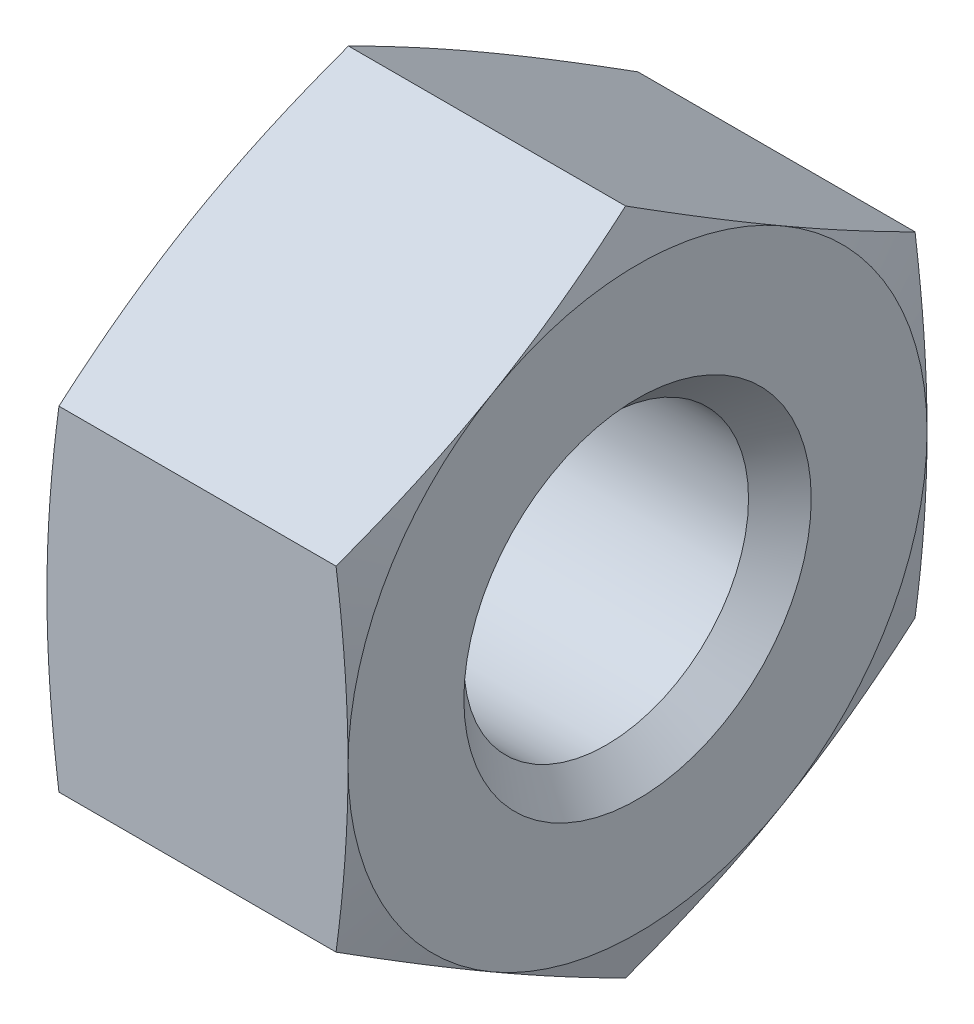
ISO-10303-21;
HEADER;
FILE_DESCRIPTION(('STEP AP214'),'2;1');
FILE_NAME('part.step','',(''),(''),'','','');
FILE_SCHEMA(('AUTOMOTIVE_DESIGN { 1 0 10303 214 1 1 1 1 }'));
ENDSEC;
DATA;
#1=APPLICATION_CONTEXT('core data for automotive mechanical design processes');
#2=APPLICATION_PROTOCOL_DEFINITION('international standard','automotive_design',2000,#1);
#3=PRODUCT_CONTEXT('',#1,'mechanical');
#4=PRODUCT('Part','Part','',(#3));
#5=PRODUCT_RELATED_PRODUCT_CATEGORY('part','',(#4));
#6=PRODUCT_DEFINITION_FORMATION('','',#4);
#7=PRODUCT_DEFINITION_CONTEXT('part definition',#1,'design');
#8=PRODUCT_DEFINITION('design','',#6,#7);
#9=PRODUCT_DEFINITION_SHAPE('','',#8);
#10=(LENGTH_UNIT() NAMED_UNIT(*) SI_UNIT(.MILLI.,.METRE.));
#11=(NAMED_UNIT(*) PLANE_ANGLE_UNIT() SI_UNIT($,.RADIAN.));
#12=(NAMED_UNIT(*) SI_UNIT($,.STERADIAN.) SOLID_ANGLE_UNIT());
#13=UNCERTAINTY_MEASURE_WITH_UNIT(LENGTH_MEASURE(1.E-05),#10,'distance_accuracy_value','');
#14=(GEOMETRIC_REPRESENTATION_CONTEXT(3) GLOBAL_UNCERTAINTY_ASSIGNED_CONTEXT((#13)) GLOBAL_UNIT_ASSIGNED_CONTEXT((#10,
#11,#12)) REPRESENTATION_CONTEXT('',''));
#15=CARTESIAN_POINT('',(0.,0.,0.));
#16=DIRECTION('',(0.,0.,1.));
#17=DIRECTION('',(1.,0.,0.));
#18=AXIS2_PLACEMENT_3D('',#15,#16,#17);
#19=CARTESIAN_POINT('',(28.,-2.5,0.));
#20=DIRECTION('',(-1.,0.,0.));
#21=DIRECTION('',(0.,0.,1.));
#22=AXIS2_PLACEMENT_3D('',#19,#20,#21);
#23=PLANE('',#22);
#24=CARTESIAN_POINT('',(27.9999999999957,0.,0.));
#25=DIRECTION('',(1.,0.,0.));
#26=DIRECTION('',(0.,0.,-1.));
#27=AXIS2_PLACEMENT_3D('',#24,#25,#26);
#28=CIRCLE('',#27,4.99999999999545);
#29=CARTESIAN_POINT('',(27.9999999999963,-4.33012701892022,-2.49999999999886));
#30=VERTEX_POINT('',#29);
#31=CARTESIAN_POINT('',(27.9999999999963,0.,-4.99999999999773));
#32=VERTEX_POINT('',#31);
#33=EDGE_CURVE('E119',#30,#32,#28,.T.);
#34=ORIENTED_EDGE('',*,*,#33,.F.);
#35=CARTESIAN_POINT('',(27.9999999999957,0.,0.));
#36=DIRECTION('',(1.,0.,0.));
#37=DIRECTION('',(0.,0.,-1.));
#38=AXIS2_PLACEMENT_3D('',#35,#36,#37);
#39=CIRCLE('',#38,4.99999999999545);
#40=CARTESIAN_POINT('',(27.9999999999963,-4.33012701892022,2.49999999999886));
#41=VERTEX_POINT('',#40);
#42=EDGE_CURVE('E107',#41,#30,#39,.T.);
#43=ORIENTED_EDGE('',*,*,#42,.F.);
#44=CARTESIAN_POINT('',(27.9999999999957,0.,0.));
#45=DIRECTION('',(1.,0.,0.));
#46=DIRECTION('',(0.,0.,-1.));
#47=AXIS2_PLACEMENT_3D('',#44,#45,#46);
#48=CIRCLE('',#47,4.99999999999545);
#49=CARTESIAN_POINT('',(27.9999999999963,0.,4.99999999999773));
#50=VERTEX_POINT('',#49);
#51=EDGE_CURVE('E115',#50,#41,#48,.T.);
#52=ORIENTED_EDGE('',*,*,#51,.F.);
#53=CARTESIAN_POINT('',(27.9999999999957,0.,0.));
#54=DIRECTION('',(1.,0.,0.));
#55=DIRECTION('',(0.,0.,-1.));
#56=AXIS2_PLACEMENT_3D('',#53,#54,#55);
#57=CIRCLE('',#56,4.99999999999545);
#58=CARTESIAN_POINT('',(27.9999999999963,4.33012701892023,2.49999999999886));
#59=VERTEX_POINT('',#58);
#60=EDGE_CURVE('E116',#59,#50,#57,.T.);
#61=ORIENTED_EDGE('',*,*,#60,.F.);
#62=CARTESIAN_POINT('',(27.9999999999957,0.,0.));
#63=DIRECTION('',(1.,0.,0.));
#64=DIRECTION('',(0.,0.,-1.));
#65=AXIS2_PLACEMENT_3D('',#62,#63,#64);
#66=CIRCLE('',#65,4.99999999999545);
#67=CARTESIAN_POINT('',(27.9999999999963,4.33012701892022,-2.49999999999886));
#68=VERTEX_POINT('',#67);
#69=EDGE_CURVE('E353',#68,#59,#66,.T.);
#70=ORIENTED_EDGE('',*,*,#69,.F.);
#71=CARTESIAN_POINT('',(27.9999999999957,0.,0.));
#72=DIRECTION('',(1.,0.,0.));
#73=DIRECTION('',(0.,0.,-1.));
#74=AXIS2_PLACEMENT_3D('',#71,#72,#73);
#75=CIRCLE('',#74,4.99999999999545);
#76=EDGE_CURVE('E102',#32,#68,#75,.T.);
#77=ORIENTED_EDGE('',*,*,#76,.F.);
#78=EDGE_LOOP('',(#34,#43,#52,#61,#70,#77));
#79=FACE_BOUND('',#78,.T.);
#80=CARTESIAN_POINT('',(28.0000000000769,0.,0.));
#81=DIRECTION('',(-1.,0.,0.));
#82=DIRECTION('',(0.,0.,1.));
#83=AXIS2_PLACEMENT_3D('',#80,#81,#82);
#84=CIRCLE('',#83,3.00000000004275);
#85=CARTESIAN_POINT('',(28.0000000000769,0.,3.00000000004275));
#86=VERTEX_POINT('',#85);
#87=EDGE_CURVE('E19',#86,#86,#84,.F.);
#88=ORIENTED_EDGE('',*,*,#87,.T.);
#89=EDGE_LOOP('',(#88));
#90=FACE_BOUND('',#89,.T.);
#91=ADVANCED_FACE('F16',(#79,#90),#23,.T.);
#92=CARTESIAN_POINT('',(27.9999999999632,0.,0.));
#93=DIRECTION('',(-1.,0.,0.));
#94=DIRECTION('',(0.,0.,1.));
#95=AXIS2_PLACEMENT_3D('',#92,#93,#94);
#96=CONICAL_SURFACE('',#95,3.00000000015643,0.785398163397449);
#97=CARTESIAN_POINT('',(28.5415,0.,0.));
#98=DIRECTION('',(-1.,0.,0.));
#99=DIRECTION('',(0.,0.,1.));
#100=AXIS2_PLACEMENT_3D('',#97,#98,#99);
#101=CIRCLE('',#100,2.4585);
#102=CARTESIAN_POINT('',(28.5415,0.,2.4585));
#103=VERTEX_POINT('',#102);
#104=EDGE_CURVE('E130',#103,#103,#101,.F.);
#105=ORIENTED_EDGE('',*,*,#104,.T.);
#106=EDGE_LOOP('',(#105));
#107=FACE_BOUND('',#106,.T.);
#108=ORIENTED_EDGE('',*,*,#87,.F.);
#109=EDGE_LOOP('',(#108));
#110=FACE_BOUND('',#109,.T.);
#111=ADVANCED_FACE('F272',(#107,#110),#96,.F.);
#112=CARTESIAN_POINT('',(28.2085029781172,0.,0.));
#113=DIRECTION('',(1.,0.,0.));
#114=DIRECTION('',(0.,0.,-1.));
#115=AXIS2_PLACEMENT_3D('',#112,#113,#114);
#116=CONICAL_SURFACE('',#115,5.77814370780061,1.30899693897207);
#117=CARTESIAN_POINT('',(28.2072594216531,-2.88675134594922,-4.99999999999812));
#118=CARTESIAN_POINT('',(28.1751868902419,-3.00640731976661,-4.79274977391727));
#119=CARTESIAN_POINT('',(28.1460634724852,-3.12627806694556,-4.58512754946207));
#120=CARTESIAN_POINT('',(28.0949189942107,-3.36625695280206,-4.16947192641484));
#121=CARTESIAN_POINT('',(28.0728898901268,-3.48636466617724,-3.96143926446813));
#122=CARTESIAN_POINT('',(28.0370556248134,-3.72692623505237,-3.54477440482791));
#123=CARTESIAN_POINT('',(28.0232524038587,-3.84738016548898,-3.33614207734033));
#124=CARTESIAN_POINT('',(28.0093512093144,-4.02825540850207,-3.02285696661029));
#125=CARTESIAN_POINT('',(28.005851364793,-4.08861477683098,-2.91831147395186));
#126=CARTESIAN_POINT('',(28.0011729767152,-4.2093578690658,-2.70917830353818));
#127=CARTESIAN_POINT('',(27.9999945078464,-4.26974159369283,-2.60459062453391));
#128=CARTESIAN_POINT('',(27.9999999999969,-4.33012701892219,-2.5));
#129=B_SPLINE_CURVE_WITH_KNOTS('',3,(#117,#118,#119,#120,#121,#122,#123,#124,#125,#126,#127,
#128),.UNSPECIFIED.,.F.,.F.,(4,2,2,2,2,4),(0.,0.724386084306961,1.44794794084586,
2.17168039959076,2.53396910222323,2.89626946090248),.UNSPECIFIED.);
#130=CARTESIAN_POINT('',(28.2072594216531,-2.88675134594759,-4.99999999999906));
#131=VERTEX_POINT('',#130);
#132=EDGE_CURVE('E125',#131,#30,#129,.T.);
#133=ORIENTED_EDGE('',*,*,#132,.T.);
#134=ORIENTED_EDGE('',*,*,#33,.T.);
#135=CARTESIAN_POINT('',(27.9999999999969,0.,-5.));
#136=CARTESIAN_POINT('',(27.9999945078464,-0.12077085045873,-5.));
#137=CARTESIAN_POINT('',(28.0011729767152,-0.241538299712794,-5.));
#138=CARTESIAN_POINT('',(28.005851364793,-0.483024484182428,-5.));
#139=CARTESIAN_POINT('',(28.0093512093144,-0.603743220840241,-5.));
#140=CARTESIAN_POINT('',(28.0232524038587,-0.965493706866423,-5.));
#141=CARTESIAN_POINT('',(28.0370556248134,-1.20640156773965,-5.));
#142=CARTESIAN_POINT('',(28.0728898901268,-1.68752470548992,-5.));
#143=CARTESIAN_POINT('',(28.0949189942107,-1.92774013224026,-5.));
#144=CARTESIAN_POINT('',(28.1460634724852,-2.40769790395326,-5.));
#145=CARTESIAN_POINT('',(28.1751868902419,-2.64743939831118,-5.));
#146=CARTESIAN_POINT('',(28.2072594216531,-2.88675134594596,-5.));
#147=B_SPLINE_CURVE_WITH_KNOTS('',3,(#135,#136,#137,#138,#139,#140,#141,#142,#143,#144,#145,
#146),.UNSPECIFIED.,.F.,.F.,(4,2,2,2,2,4),(0.,0.36230035867925,0.724589061311718,
1.44832152005662,2.17188337659552,2.89626946090248),.UNSPECIFIED.);
#148=EDGE_CURVE('E127',#32,#131,#147,.T.);
#149=ORIENTED_EDGE('',*,*,#148,.T.);
#150=EDGE_LOOP('',(#133,#134,#149));
#151=FACE_BOUND('',#150,.T.);
#152=ADVANCED_FACE('F126',(#151),#116,.T.);
#153=CARTESIAN_POINT('',(28.2085029781172,0.,0.));
#154=DIRECTION('',(1.,0.,0.));
#155=DIRECTION('',(0.,0.,-1.));
#156=AXIS2_PLACEMENT_3D('',#153,#154,#155);
#157=CONICAL_SURFACE('',#156,5.77814370780061,1.30899693897207);
#158=ORIENTED_EDGE('',*,*,#76,.T.);
#159=CARTESIAN_POINT('',(27.9999999999969,4.33012701892219,-2.5));
#160=CARTESIAN_POINT('',(27.9999945078464,4.26974159369283,-2.60459062453391));
#161=CARTESIAN_POINT('',(28.0011729767152,4.2093578690658,-2.70917830353818));
#162=CARTESIAN_POINT('',(28.005851364793,4.08861477683098,-2.91831147395186));
#163=CARTESIAN_POINT('',(28.0093512093144,4.02825540850207,-3.02285696661029));
#164=CARTESIAN_POINT('',(28.0232524038587,3.84738016548898,-3.33614207734033));
#165=CARTESIAN_POINT('',(28.0370556248134,3.72692623505237,-3.54477440482791));
#166=CARTESIAN_POINT('',(28.0728898901268,3.48636466617723,-3.96143926446812));
#167=CARTESIAN_POINT('',(28.0949189942107,3.36625695280206,-4.16947192641484));
#168=CARTESIAN_POINT('',(28.1460634724852,3.12627806694556,-4.58512754946207));
#169=CARTESIAN_POINT('',(28.1751868902419,3.0064073197666,-4.79274977391727));
#170=CARTESIAN_POINT('',(28.2072594216531,2.88675134594922,-4.99999999999812));
#171=B_SPLINE_CURVE_WITH_KNOTS('',3,(#159,#160,#161,#162,#163,#164,#165,#166,#167,#168,#169,
#170),.UNSPECIFIED.,.F.,.F.,(4,2,2,2,2,4),(0.,0.36230035867925,0.724589061311717,
1.44832152005662,2.17188337659552,2.89626946090248),.UNSPECIFIED.);
#172=CARTESIAN_POINT('',(28.2072594216531,2.88675134594759,-4.99999999999906));
#173=VERTEX_POINT('',#172);
#174=EDGE_CURVE('E374',#68,#173,#171,.T.);
#175=ORIENTED_EDGE('',*,*,#174,.T.);
#176=CARTESIAN_POINT('',(28.2072594216531,2.88675134594596,-5.));
#177=CARTESIAN_POINT('',(28.1751868902419,2.64743939831118,-5.));
#178=CARTESIAN_POINT('',(28.1460634724852,2.40769790395326,-5.));
#179=CARTESIAN_POINT('',(28.0949189942107,1.92774013224026,-5.));
#180=CARTESIAN_POINT('',(28.0728898901268,1.68752470548992,-5.));
#181=CARTESIAN_POINT('',(28.0370556248134,1.20640156773965,-5.));
#182=CARTESIAN_POINT('',(28.0232524038587,0.965493706866422,-5.));
#183=CARTESIAN_POINT('',(28.0093512093144,0.60374322084024,-5.));
#184=CARTESIAN_POINT('',(28.005851364793,0.483024484182426,-5.));
#185=CARTESIAN_POINT('',(28.0011729767152,0.241538299712792,-5.));
#186=CARTESIAN_POINT('',(27.9999945078464,0.120770850458729,-5.));
#187=CARTESIAN_POINT('',(27.9999999999969,0.,-5.));
#188=B_SPLINE_CURVE_WITH_KNOTS('',3,(#176,#177,#178,#179,#180,#181,#182,#183,#184,#185,#186,
#187),.UNSPECIFIED.,.F.,.F.,(4,2,2,2,2,4),(0.,0.724386084306962,1.44794794084586,
2.17168039959077,2.53396910222323,2.89626946090248),.UNSPECIFIED.);
#189=EDGE_CURVE('E135',#173,#32,#188,.T.);
#190=ORIENTED_EDGE('',*,*,#189,.T.);
#191=EDGE_LOOP('',(#158,#175,#190));
#192=FACE_BOUND('',#191,.T.);
#193=ADVANCED_FACE('F271',(#192),#157,.T.);
#194=CARTESIAN_POINT('',(28.2085029781172,0.,0.));
#195=DIRECTION('',(1.,0.,0.));
#196=DIRECTION('',(0.,0.,-1.));
#197=AXIS2_PLACEMENT_3D('',#194,#195,#196);
#198=CONICAL_SURFACE('',#197,5.77814370780061,1.30899693897207);
#199=ORIENTED_EDGE('',*,*,#69,.T.);
#200=CARTESIAN_POINT('',(27.9999999999969,4.3301270189222,2.5));
#201=CARTESIAN_POINT('',(27.9999945078464,4.39051244415103,2.39540937546701));
#202=CARTESIAN_POINT('',(28.0011729767152,4.45089616877753,2.29082169646366));
#203=CARTESIAN_POINT('',(28.0058513647929,4.57163926101128,2.08168852605182));
#204=CARTESIAN_POINT('',(28.0093512093142,4.63199862933966,1.97714303339431));
#205=CARTESIAN_POINT('',(28.0232524038583,4.81287387235117,1.66385792266702));
#206=CARTESIAN_POINT('',(28.0370556248128,4.93332780278673,1.45522559518126));
#207=CARTESIAN_POINT('',(28.0728898901256,5.17388937165976,1.03856073554468));
#208=CARTESIAN_POINT('',(28.0949189942091,5.29399708503389,0.830528073599776));
#209=CARTESIAN_POINT('',(28.1460634724828,5.5339759708883,0.414872450556162));
#210=CARTESIAN_POINT('',(28.175186890239,5.65384671806622,0.207250226102765));
#211=CARTESIAN_POINT('',(28.2072594216498,5.77350269188257,2.37145483499561E-11));
#212=B_SPLINE_CURVE_WITH_KNOTS('',3,(#200,#201,#202,#203,#204,#205,#206,#207,#208,#209,#210,
#211),.UNSPECIFIED.,.F.,.F.,(4,2,2,2,2,4),(0.,0.362300358676065,0.724589061305347,
1.4483215200439,2.17188337657645,2.89626946087705),.UNSPECIFIED.);
#213=CARTESIAN_POINT('',(28.2072594216849,5.77350269196408,-1.11263001348021E-11));
#214=VERTEX_POINT('',#213);
#215=EDGE_CURVE('E327',#59,#214,#212,.T.);
#216=ORIENTED_EDGE('',*,*,#215,.T.);
#217=CARTESIAN_POINT('',(28.2072594216626,5.77350269186875,-1.57368146966054E-11));
#218=CARTESIAN_POINT('',(28.1751868902437,5.65384671806165,-0.207250226099235));
#219=CARTESIAN_POINT('',(28.1460634724841,5.53397597088746,-0.414872450554556));
#220=CARTESIAN_POINT('',(28.0949189942079,5.29399708503567,-0.830528073599747));
#221=CARTESIAN_POINT('',(28.0728898901253,5.17388937166044,-1.03856073554431));
#222=CARTESIAN_POINT('',(28.0370556248131,4.93332780278657,-1.45522559518071));
#223=CARTESIAN_POINT('',(28.0232524038584,4.81287387235129,-1.66385792266664));
#224=CARTESIAN_POINT('',(28.0093512093142,4.63199862933984,-1.97714303339407));
#225=CARTESIAN_POINT('',(28.0058513647929,4.57163926101142,-2.08168852605162));
#226=CARTESIAN_POINT('',(28.0011729767152,4.45089616877757,-2.29082169646354));
#227=CARTESIAN_POINT('',(27.9999945078464,4.39051244415102,-2.39540937546694));
#228=CARTESIAN_POINT('',(27.9999999999969,4.33012701892219,-2.5));
#229=B_SPLINE_CURVE_WITH_KNOTS('',3,(#217,#218,#219,#220,#221,#222,#223,#224,#225,#226,#227,
#228),.UNSPECIFIED.,.F.,.F.,(4,2,2,2,2,4),(0.,0.724386084301217,1.44794794083421,
2.17168039957289,2.53396910220233,2.89626946087859),.UNSPECIFIED.);
#230=EDGE_CURVE('E264',#214,#68,#229,.T.);
#231=ORIENTED_EDGE('',*,*,#230,.T.);
#232=EDGE_LOOP('',(#199,#216,#231));
#233=FACE_BOUND('',#232,.T.);
#234=ADVANCED_FACE('F340',(#233),#198,.T.);
#235=CARTESIAN_POINT('',(28.2085029781172,0.,0.));
#236=DIRECTION('',(1.,0.,0.));
#237=DIRECTION('',(0.,0.,-1.));
#238=AXIS2_PLACEMENT_3D('',#235,#236,#237);
#239=CONICAL_SURFACE('',#238,5.77814370780061,1.30899693897207);
#240=ORIENTED_EDGE('',*,*,#60,.T.);
#241=CARTESIAN_POINT('',(27.9999999999969,0.,5.));
#242=CARTESIAN_POINT('',(27.9999945078464,0.12077085045873,5.));
#243=CARTESIAN_POINT('',(28.0011729767152,0.241538299712793,5.));
#244=CARTESIAN_POINT('',(28.005851364793,0.483024484182427,5.));
#245=CARTESIAN_POINT('',(28.0093512093144,0.60374322084024,5.));
#246=CARTESIAN_POINT('',(28.0232524038587,0.965493706866423,5.));
#247=CARTESIAN_POINT('',(28.0370556248134,1.20640156773965,5.));
#248=CARTESIAN_POINT('',(28.0728898901268,1.68752470548992,5.));
#249=CARTESIAN_POINT('',(28.0949189942107,1.92774013224027,5.));
#250=CARTESIAN_POINT('',(28.1460634724852,2.40769790395326,5.));
#251=CARTESIAN_POINT('',(28.1751868902419,2.64743939831118,5.));
#252=CARTESIAN_POINT('',(28.2072594216531,2.88675134594596,5.));
#253=B_SPLINE_CURVE_WITH_KNOTS('',3,(#241,#242,#243,#244,#245,#246,#247,#248,#249,#250,#251,
#252),.UNSPECIFIED.,.F.,.F.,(4,2,2,2,2,4),(0.,0.36230035867925,0.724589061311718,
1.44832152005662,2.17188337659552,2.89626946090248),.UNSPECIFIED.);
#254=CARTESIAN_POINT('',(28.2072594216531,2.88675134594759,4.99999999999906));
#255=VERTEX_POINT('',#254);
#256=EDGE_CURVE('E178',#50,#255,#253,.T.);
#257=ORIENTED_EDGE('',*,*,#256,.T.);
#258=CARTESIAN_POINT('',(28.2072594216531,2.88675134594922,4.99999999999812));
#259=CARTESIAN_POINT('',(28.1751868902419,3.00640731976661,4.79274977391727));
#260=CARTESIAN_POINT('',(28.1460634724852,3.12627806694557,4.58512754946207));
#261=CARTESIAN_POINT('',(28.0949189942107,3.36625695280206,4.16947192641484));
#262=CARTESIAN_POINT('',(28.0728898901268,3.48636466617724,3.96143926446812));
#263=CARTESIAN_POINT('',(28.0370556248134,3.72692623505237,3.54477440482791));
#264=CARTESIAN_POINT('',(28.0232524038587,3.84738016548898,3.33614207734033));
#265=CARTESIAN_POINT('',(28.0093512093144,4.02825540850208,3.02285696661029));
#266=CARTESIAN_POINT('',(28.005851364793,4.08861477683098,2.91831147395186));
#267=CARTESIAN_POINT('',(28.0011729767152,4.2093578690658,2.70917830353818));
#268=CARTESIAN_POINT('',(27.9999945078464,4.26974159369283,2.60459062453391));
#269=CARTESIAN_POINT('',(27.9999999999969,4.33012701892219,2.5));
#270=B_SPLINE_CURVE_WITH_KNOTS('',3,(#258,#259,#260,#261,#262,#263,#264,#265,#266,#267,#268,
#269),.UNSPECIFIED.,.F.,.F.,(4,2,2,2,2,4),(0.,0.724386084306961,1.44794794084586,
2.17168039959076,2.53396910222323,2.89626946090248),.UNSPECIFIED.);
#271=EDGE_CURVE('E332',#255,#59,#270,.T.);
#272=ORIENTED_EDGE('',*,*,#271,.T.);
#273=EDGE_LOOP('',(#240,#257,#272));
#274=FACE_BOUND('',#273,.T.);
#275=ADVANCED_FACE('F161',(#274),#239,.T.);
#276=CARTESIAN_POINT('',(28.2085029781172,0.,0.));
#277=DIRECTION('',(1.,0.,0.));
#278=DIRECTION('',(0.,0.,-1.));
#279=AXIS2_PLACEMENT_3D('',#276,#277,#278);
#280=CONICAL_SURFACE('',#279,5.77814370780061,1.30899693897207);
#281=CARTESIAN_POINT('',(28.2072594216626,-5.77350269186875,1.57369260872493E-11));
#282=CARTESIAN_POINT('',(28.1751868902437,-5.65384671806165,0.207250226099235));
#283=CARTESIAN_POINT('',(28.1460634724841,-5.53397597088746,0.414872450554557));
#284=CARTESIAN_POINT('',(28.0949189942079,-5.29399708503567,0.830528073599747));
#285=CARTESIAN_POINT('',(28.0728898901253,-5.17388937166044,1.03856073554431));
#286=CARTESIAN_POINT('',(28.0370556248131,-4.93332780278657,1.45522559518071));
#287=CARTESIAN_POINT('',(28.0232524038584,-4.81287387235129,1.66385792266664));
#288=CARTESIAN_POINT('',(28.0093512093142,-4.63199862933984,1.97714303339407));
#289=CARTESIAN_POINT('',(28.0058513647929,-4.57163926101142,2.08168852605162));
#290=CARTESIAN_POINT('',(28.0011729767152,-4.45089616877757,2.29082169646354));
#291=CARTESIAN_POINT('',(27.9999945078464,-4.39051244415102,2.39540937546694));
#292=CARTESIAN_POINT('',(27.9999999999969,-4.33012701892219,2.5));
#293=B_SPLINE_CURVE_WITH_KNOTS('',3,(#281,#282,#283,#284,#285,#286,#287,#288,#289,#290,#291,
#292),.UNSPECIFIED.,.F.,.F.,(4,2,2,2,2,4),(0.,0.724386084301217,1.44794794083421,
2.17168039957289,2.53396910220233,2.89626946087859),.UNSPECIFIED.);
#294=CARTESIAN_POINT('',(28.2072594216346,-5.77350269189162,0.));
#295=VERTEX_POINT('',#294);
#296=EDGE_CURVE('E113',#295,#41,#293,.T.);
#297=ORIENTED_EDGE('',*,*,#296,.T.);
#298=ORIENTED_EDGE('',*,*,#42,.T.);
#299=CARTESIAN_POINT('',(27.9999999999969,-4.33012701892219,-2.5));
#300=CARTESIAN_POINT('',(27.9999945078464,-4.39051244415103,-2.39540937546701));
#301=CARTESIAN_POINT('',(28.0011729767152,-4.45089616877753,-2.29082169646366));
#302=CARTESIAN_POINT('',(28.0058513647929,-4.57163926101128,-2.08168852605182));
#303=CARTESIAN_POINT('',(28.0093512093142,-4.63199862933966,-1.97714303339431));
#304=CARTESIAN_POINT('',(28.0232524038583,-4.81287387235117,-1.66385792266702));
#305=CARTESIAN_POINT('',(28.0370556248128,-4.93332780278673,-1.45522559518126));
#306=CARTESIAN_POINT('',(28.0728898901256,-5.17388937165976,-1.03856073554468));
#307=CARTESIAN_POINT('',(28.0949189942091,-5.29399708503389,-0.830528073599777));
#308=CARTESIAN_POINT('',(28.1460634724828,-5.5339759708883,-0.414872450556163));
#309=CARTESIAN_POINT('',(28.175186890239,-5.65384671806622,-0.207250226102765));
#310=CARTESIAN_POINT('',(28.2072594216498,-5.77350269188257,-2.37145802861049E-11));
#311=B_SPLINE_CURVE_WITH_KNOTS('',3,(#299,#300,#301,#302,#303,#304,#305,#306,#307,#308,#309,
#310),.UNSPECIFIED.,.F.,.F.,(4,2,2,2,2,4),(0.,0.362300358676064,0.724589061305347,
1.4483215200439,2.17188337657645,2.89626946087705),.UNSPECIFIED.);
#312=EDGE_CURVE('E110',#30,#295,#311,.T.);
#313=ORIENTED_EDGE('',*,*,#312,.T.);
#314=EDGE_LOOP('',(#297,#298,#313));
#315=FACE_BOUND('',#314,.T.);
#316=ADVANCED_FACE('F108',(#315),#280,.T.);
#317=CARTESIAN_POINT('',(28.2085029781172,0.,0.));
#318=DIRECTION('',(1.,0.,0.));
#319=DIRECTION('',(0.,0.,-1.));
#320=AXIS2_PLACEMENT_3D('',#317,#318,#319);
#321=CONICAL_SURFACE('',#320,5.77814370780061,1.30899693897207);
#322=CARTESIAN_POINT('',(28.2072594216531,-2.88675134594595,5.));
#323=CARTESIAN_POINT('',(28.1751868902419,-2.64743939831118,5.));
#324=CARTESIAN_POINT('',(28.1460634724852,-2.40769790395326,5.));
#325=CARTESIAN_POINT('',(28.0949189942107,-1.92774013224026,5.));
#326=CARTESIAN_POINT('',(28.0728898901268,-1.68752470548992,5.));
#327=CARTESIAN_POINT('',(28.0370556248134,-1.20640156773965,5.));
#328=CARTESIAN_POINT('',(28.0232524038587,-0.965493706866422,5.));
#329=CARTESIAN_POINT('',(28.0093512093144,-0.60374322084024,5.));
#330=CARTESIAN_POINT('',(28.005851364793,-0.483024484182426,5.));
#331=CARTESIAN_POINT('',(28.0011729767152,-0.241538299712793,5.));
#332=CARTESIAN_POINT('',(27.9999945078464,-0.120770850458729,5.));
#333=CARTESIAN_POINT('',(27.9999999999969,0.,5.));
#334=B_SPLINE_CURVE_WITH_KNOTS('',3,(#322,#323,#324,#325,#326,#327,#328,#329,#330,#331,#332,
#333),.UNSPECIFIED.,.F.,.F.,(4,2,2,2,2,4),(0.,0.724386084306962,1.44794794084586,
2.17168039959077,2.53396910222323,2.89626946090248),.UNSPECIFIED.);
#335=CARTESIAN_POINT('',(28.2072594216531,-2.88675134594759,4.99999999999906));
#336=VERTEX_POINT('',#335);
#337=EDGE_CURVE('E333',#336,#50,#334,.T.);
#338=ORIENTED_EDGE('',*,*,#337,.T.);
#339=ORIENTED_EDGE('',*,*,#51,.T.);
#340=CARTESIAN_POINT('',(27.9999999999969,-4.33012701892219,2.5));
#341=CARTESIAN_POINT('',(27.9999945078464,-4.26974159369283,2.60459062453391));
#342=CARTESIAN_POINT('',(28.0011729767152,-4.2093578690658,2.70917830353818));
#343=CARTESIAN_POINT('',(28.005851364793,-4.08861477683098,2.91831147395186));
#344=CARTESIAN_POINT('',(28.0093512093144,-4.02825540850207,3.02285696661029));
#345=CARTESIAN_POINT('',(28.0232524038587,-3.84738016548898,3.33614207734033));
#346=CARTESIAN_POINT('',(28.0370556248134,-3.72692623505237,3.54477440482791));
#347=CARTESIAN_POINT('',(28.0728898901268,-3.48636466617723,3.96143926446813));
#348=CARTESIAN_POINT('',(28.0949189942107,-3.36625695280206,4.16947192641484));
#349=CARTESIAN_POINT('',(28.1460634724852,-3.12627806694556,4.58512754946207));
#350=CARTESIAN_POINT('',(28.1751868902419,-3.0064073197666,4.79274977391727));
#351=CARTESIAN_POINT('',(28.2072594216531,-2.88675134594922,4.99999999999812));
#352=B_SPLINE_CURVE_WITH_KNOTS('',3,(#340,#341,#342,#343,#344,#345,#346,#347,#348,#349,#350,
#351),.UNSPECIFIED.,.F.,.F.,(4,2,2,2,2,4),(0.,0.36230035867925,0.724589061311717,
1.44832152005662,2.17188337659552,2.89626946090248),.UNSPECIFIED.);
#353=EDGE_CURVE('E173',#41,#336,#352,.T.);
#354=ORIENTED_EDGE('',*,*,#353,.T.);
#355=EDGE_LOOP('',(#338,#339,#354));
#356=FACE_BOUND('',#355,.T.);
#357=ADVANCED_FACE('F160',(#356),#321,.T.);
#358=CARTESIAN_POINT('',(30.6,0.,0.));
#359=DIRECTION('',(-1.,0.,0.));
#360=DIRECTION('',(0.,0.,1.));
#361=AXIS2_PLACEMENT_3D('',#358,#359,#360);
#362=CYLINDRICAL_SURFACE('',#361,2.4585);
#363=CARTESIAN_POINT('',(32.6584999999682,0.,0.));
#364=DIRECTION('',(1.,0.,0.));
#365=DIRECTION('',(0.,-1.,0.));
#366=AXIS2_PLACEMENT_3D('',#363,#364,#365);
#367=CIRCLE('',#366,2.45850000004566);
#368=CARTESIAN_POINT('',(32.6584999999682,-2.45850000004566,0.));
#369=VERTEX_POINT('',#368);
#370=EDGE_CURVE('E212',#369,#369,#367,.T.);
#371=ORIENTED_EDGE('',*,*,#370,.T.);
#372=EDGE_LOOP('',(#371));
#373=FACE_BOUND('',#372,.T.);
#374=ORIENTED_EDGE('',*,*,#104,.F.);
#375=EDGE_LOOP('',(#374));
#376=FACE_BOUND('',#375,.T.);
#377=ADVANCED_FACE('F482',(#373,#376),#362,.F.);
#378=CARTESIAN_POINT('',(25.4,-5.77350269189626,0.));
#379=DIRECTION('',(0.,0.866025403784439,0.5));
#380=DIRECTION('',(0.,-0.5,0.866025403784439));
#381=AXIS2_PLACEMENT_3D('',#378,#379,#380);
#382=PLANE('',#381);
#383=CARTESIAN_POINT('',(32.9927405783793,-5.77350269189745,2.06068812559545E-12));
#384=CARTESIAN_POINT('',(33.0248131097924,-5.65384671807994,-0.207250226078998));
#385=CARTESIAN_POINT('',(33.0539365275506,-5.53397597090084,-0.414872450534448));
#386=CARTESIAN_POINT('',(33.1050810058281,-5.29399708504402,-0.830528073582221));
#387=CARTESIAN_POINT('',(33.1271101099131,-5.17388937166868,-1.03856073552924));
#388=CARTESIAN_POINT('',(33.1629443752286,-4.93332780279317,-1.4552255951701));
#389=CARTESIAN_POINT('',(33.1767475961841,-4.81287387235634,-1.66385792265805));
#390=CARTESIAN_POINT('',(33.1906487907293,-4.63199862934292,-1.97714303338867));
#391=CARTESIAN_POINT('',(33.1941486352508,-4.57163926101389,-2.08168852604731));
#392=CARTESIAN_POINT('',(33.1988270233289,-4.45089616877883,-2.2908216964614));
#393=CARTESIAN_POINT('',(33.2000054921978,-4.39051244415168,-2.39540937546588));
#394=CARTESIAN_POINT('',(33.2000000000473,-4.33012701892219,-2.5));
#395=B_SPLINE_CURVE_WITH_KNOTS('',3,(#383,#384,#385,#386,#387,#388,#389,#390,#391,#392,#393,
#394),.UNSPECIFIED.,.F.,.F.,(4,2,2,2,2,4),(0.,0.7243860843084,1.44794794084865,2.17168039959492,
2.53396910222811,2.8962694609081),.UNSPECIFIED.);
#396=CARTESIAN_POINT('',(32.9927405783929,-5.77350269190004,-1.03246587288471E-12));
#397=VERTEX_POINT('',#396);
#398=CARTESIAN_POINT('',(33.2000000000555,-4.33012701889561,-2.49999999998466));
#399=VERTEX_POINT('',#398);
#400=EDGE_CURVE('E211',#397,#399,#395,.T.);
#401=ORIENTED_EDGE('',*,*,#400,.F.);
#402=DIRECTION('',(1.,0.,0.));
#403=VECTOR('',#402,1.);
#404=CARTESIAN_POINT('',(25.4,-5.77350269189626,0.));
#405=LINE('',#404,#403);
#406=EDGE_CURVE('E134',#397,#295,#405,.F.);
#407=ORIENTED_EDGE('',*,*,#406,.T.);
#408=ORIENTED_EDGE('',*,*,#312,.F.);
#409=ORIENTED_EDGE('',*,*,#132,.F.);
#410=DIRECTION('',(1.,0.,0.));
#411=VECTOR('',#410,1.);
#412=CARTESIAN_POINT('',(25.4,-2.88675134594813,-5.));
#413=LINE('',#412,#411);
#414=CARTESIAN_POINT('',(32.9927405848526,-2.88675129763333,-5.));
#415=VERTEX_POINT('',#414);
#416=EDGE_CURVE('E263',#131,#415,#413,.T.);
#417=ORIENTED_EDGE('',*,*,#416,.T.);
#418=CARTESIAN_POINT('',(33.2000000000473,-4.33012701892219,-2.5));
#419=CARTESIAN_POINT('',(33.2000054921981,-4.26974159272882,-2.60459062620363));
#420=CARTESIAN_POINT('',(33.1988270232914,-4.20935786713786,-2.70917830687747));
#421=CARTESIAN_POINT('',(33.1941486350643,-4.08861477297641,-2.91831148062817));
#422=CARTESIAN_POINT('',(33.1906487904316,-4.0282554036848,-3.02285697495406));
#423=CARTESIAN_POINT('',(33.1767475954479,-3.8473801577921,-3.33614209067172));
#424=CARTESIAN_POINT('',(33.16294437406,-3.72692622544152,-3.54477442147439));
#425=CARTESIAN_POINT('',(33.1271101076508,-3.48636465275414,-3.96143928771761));
#426=CARTESIAN_POINT('',(33.1050810029046,-3.36625693748068,-4.16947195295226));
#427=CARTESIAN_POINT('',(33.0539365231355,-3.12627804783601,-4.58512758256079));
#428=CARTESIAN_POINT('',(33.0248131045463,-3.0064072987672,-4.79274981028931));
#429=CARTESIAN_POINT('',(32.9927405722487,-2.88675132306695,-5.00000003963136));
#430=B_SPLINE_CURVE_WITH_KNOTS('',3,(#418,#419,#420,#421,#422,#423,#424,#425,#426,#427,#428,
#429),.UNSPECIFIED.,.F.,.F.,(4,2,2,2,2,4),(0.,0.362300364462729,0.724589072877742,
1.44832154315424,2.17188341121312,2.89626950707299),.UNSPECIFIED.);
#431=EDGE_CURVE('E233',#399,#415,#430,.T.);
#432=ORIENTED_EDGE('',*,*,#431,.F.);
#433=EDGE_LOOP('',(#401,#407,#408,#409,#417,#432));
#434=FACE_BOUND('',#433,.T.);
#435=ADVANCED_FACE('F133',(#434),#382,.F.);
#436=CARTESIAN_POINT('',(25.4,-2.88675134594813,-5.));
#437=DIRECTION('',(0.,0.,1.));
#438=DIRECTION('',(1.,0.,0.));
#439=AXIS2_PLACEMENT_3D('',#436,#437,#438);
#440=PLANE('',#439);
#441=CARTESIAN_POINT('',(32.9927405913256,-2.88675124931853,-5.));
#442=CARTESIAN_POINT('',(33.0248131208706,-2.6474393096351,-5.));
#443=CARTESIAN_POINT('',(33.0539365368742,-2.40769782325796,-5.));
#444=CARTESIAN_POINT('',(33.1050810120017,-1.92774006754206,-5.));
#445=CARTESIAN_POINT('',(33.1271101146906,-1.68752464880793,-5.));
#446=CARTESIAN_POINT('',(33.1629443776964,-1.20640152715607,-5.));
#447=CARTESIAN_POINT('',(33.1767475977387,-0.965493674365046,-5.));
#448=CARTESIAN_POINT('',(33.1906487913577,-0.603743200498573,-5.));
#449=CARTESIAN_POINT('',(33.1941486356445,-0.48302446790594,-5.));
#450=CARTESIAN_POINT('',(33.198827023408,-0.241538291571803,-5.));
#451=CARTESIAN_POINT('',(33.200005492197,-0.120770846388057,-5.));
#452=CARTESIAN_POINT('',(33.2000000000473,0.,-5.));
#453=B_SPLINE_CURVE_WITH_KNOTS('',3,(#441,#442,#443,#444,#445,#446,#447,#448,#449,#450,#451,
#452),.UNSPECIFIED.,.F.,.F.,(4,2,2,2,2,4),(0.,0.724386059914988,1.44794789213117,
2.17168032652889,2.53396901695254,2.89626936342101),.UNSPECIFIED.);
#454=CARTESIAN_POINT('',(33.2000000000555,0.,-4.99999999996931));
#455=VERTEX_POINT('',#454);
#456=EDGE_CURVE('E238',#415,#455,#453,.T.);
#457=ORIENTED_EDGE('',*,*,#456,.F.);
#458=ORIENTED_EDGE('',*,*,#416,.F.);
#459=ORIENTED_EDGE('',*,*,#148,.F.);
#460=ORIENTED_EDGE('',*,*,#189,.F.);
#461=DIRECTION('',(1.,0.,0.));
#462=VECTOR('',#461,1.);
#463=CARTESIAN_POINT('',(25.4,2.88675134594813,-5.));
#464=LINE('',#463,#462);
#465=CARTESIAN_POINT('',(32.992740584851,2.88675137009967,-4.99999995816831));
#466=VERTEX_POINT('',#465);
#467=EDGE_CURVE('E372',#173,#466,#464,.T.);
#468=ORIENTED_EDGE('',*,*,#467,.T.);
#469=CARTESIAN_POINT('',(33.2000000000473,0.,-5.));
#470=CARTESIAN_POINT('',(33.2000054921981,0.120770852387773,-5.));
#471=CARTESIAN_POINT('',(33.1988270232914,0.24153830357071,-5.));
#472=CARTESIAN_POINT('',(33.1941486350642,0.483024491895648,-5.));
#473=CARTESIAN_POINT('',(33.1906487904315,0.603743230479893,-5.));
#474=CARTESIAN_POINT('',(33.1767475954475,0.965493722268327,-5.));
#475=CARTESIAN_POINT('',(33.1629443740593,1.20640158697152,-5.));
#476=CARTESIAN_POINT('',(33.1271101076496,1.68752473235032,-5.));
#477=CARTESIAN_POINT('',(33.105081002903,1.92774016289925,-5.));
#478=CARTESIAN_POINT('',(33.0539365231331,2.40769794219259,-5.));
#479=CARTESIAN_POINT('',(33.0248131045435,2.64743944033222,-5.));
#480=CARTESIAN_POINT('',(32.9927405722454,2.8867513917347,-5.));
#481=B_SPLINE_CURVE_WITH_KNOTS('',3,(#469,#470,#471,#472,#473,#474,#475,#476,#477,#478,#479,
#480),.UNSPECIFIED.,.F.,.F.,(4,2,2,2,2,4),(0.,0.36230036446579,0.724589072883863,
1.44832154316646,2.17188341123144,2.89626950709743),.UNSPECIFIED.);
#482=EDGE_CURVE('E253',#455,#466,#481,.T.);
#483=ORIENTED_EDGE('',*,*,#482,.F.);
#484=EDGE_LOOP('',(#457,#458,#459,#460,#468,#483));
#485=FACE_BOUND('',#484,.T.);
#486=ADVANCED_FACE('F243',(#485),#440,.F.);
#487=CARTESIAN_POINT('',(25.4,2.88675134594813,-5.));
#488=DIRECTION('',(0.,-0.866025403784439,0.5));
#489=DIRECTION('',(0.,-0.5,-0.866025403784439));
#490=AXIS2_PLACEMENT_3D('',#487,#488,#489);
#491=PLANE('',#490);
#492=CARTESIAN_POINT('',(32.9927405913348,2.88675139426397,-4.9999999163459));
#493=CARTESIAN_POINT('',(33.0248131208723,3.00640736409837,-4.79274969714365));
#494=CARTESIAN_POINT('',(33.0539365368731,3.12627810728451,-4.58512747959597));
#495=CARTESIAN_POINT('',(33.1050810119989,3.36625698514191,-4.16947187039758));
#496=CARTESIAN_POINT('',(33.1271101146891,3.48636469451085,-3.96143921539208));
#497=CARTESIAN_POINT('',(33.1629443776961,3.72692625533943,-3.54477436969049));
#498=CARTESIAN_POINT('',(33.1767475977384,3.8473801817357,-3.33614204920034));
#499=CARTESIAN_POINT('',(33.1906487913576,4.02825541867038,-3.02285694899819));
#500=CARTESIAN_POINT('',(33.1941486356444,4.08861478496721,-2.91831145985945));
#501=CARTESIAN_POINT('',(33.198827023408,4.20935787313531,-2.70917829648961));
#502=CARTESIAN_POINT('',(33.2000054921971,4.2697415957277,-2.60459062100949));
#503=CARTESIAN_POINT('',(33.2000000000473,4.33012701892219,-2.5));
#504=B_SPLINE_CURVE_WITH_KNOTS('',3,(#492,#493,#494,#495,#496,#497,#498,#499,#500,#501,#502,
#503),.UNSPECIFIED.,.F.,.F.,(4,2,2,2,2,4),(0.,0.72438605992072,1.44794789214279,2.1716803265467,
2.53396901697338,2.89626936344483),.UNSPECIFIED.);
#505=CARTESIAN_POINT('',(33.2000000000555,4.33012701889561,-2.49999999998465));
#506=VERTEX_POINT('',#505);
#507=EDGE_CURVE('E415',#466,#506,#504,.T.);
#508=ORIENTED_EDGE('',*,*,#507,.F.);
#509=ORIENTED_EDGE('',*,*,#467,.F.);
#510=ORIENTED_EDGE('',*,*,#174,.F.);
#511=ORIENTED_EDGE('',*,*,#230,.F.);
#512=DIRECTION('',(1.,0.,0.));
#513=VECTOR('',#512,1.);
#514=CARTESIAN_POINT('',(25.4,5.77350269189626,0.));
#515=LINE('',#514,#513);
#516=CARTESIAN_POINT('',(32.9927405783929,5.77350269190004,1.03227251545638E-12));
#517=VERTEX_POINT('',#516);
#518=EDGE_CURVE('E331',#214,#517,#515,.T.);
#519=ORIENTED_EDGE('',*,*,#518,.T.);
#520=CARTESIAN_POINT('',(33.2000000000473,4.33012701892219,-2.5));
#521=CARTESIAN_POINT('',(33.2000054921978,4.39051244415168,-2.39540937546588));
#522=CARTESIAN_POINT('',(33.1988270233289,4.45089616877883,-2.2908216964614));
#523=CARTESIAN_POINT('',(33.1941486352508,4.57163926101389,-2.0816885260473));
#524=CARTESIAN_POINT('',(33.1906487907293,4.63199862934292,-1.97714303338867));
#525=CARTESIAN_POINT('',(33.1767475961841,4.81287387235634,-1.66385792265805));
#526=CARTESIAN_POINT('',(33.1629443752286,4.93332780279317,-1.4552255951701));
#527=CARTESIAN_POINT('',(33.1271101099131,5.17388937166868,-1.03856073552923));
#528=CARTESIAN_POINT('',(33.1050810058281,5.29399708504402,-0.830528073582218));
#529=CARTESIAN_POINT('',(33.0539365275506,5.53397597090084,-0.414872450534445));
#530=CARTESIAN_POINT('',(33.0248131097924,5.65384671807994,-0.207250226078994));
#531=CARTESIAN_POINT('',(32.9927405783793,5.77350269189745,2.06346388996269E-12));
#532=B_SPLINE_CURVE_WITH_KNOTS('',3,(#520,#521,#522,#523,#524,#525,#526,#527,#528,#529,#530,
#531),.UNSPECIFIED.,.F.,.F.,(4,2,2,2,2,4),(0.,0.362300358679981,0.724589061313178,
1.44832152005945,2.17188337659969,2.89626946090809),.UNSPECIFIED.);
#533=EDGE_CURVE('E425',#506,#517,#532,.T.);
#534=ORIENTED_EDGE('',*,*,#533,.F.);
#535=EDGE_LOOP('',(#508,#509,#510,#511,#519,#534));
#536=FACE_BOUND('',#535,.T.);
#537=ADVANCED_FACE('F247',(#536),#491,.F.);
#538=CARTESIAN_POINT('',(25.4,5.77350269189626,0.));
#539=DIRECTION('',(0.,-0.866025403784439,-0.5));
#540=DIRECTION('',(0.,0.5,-0.866025403784439));
#541=AXIS2_PLACEMENT_3D('',#538,#539,#540);
#542=PLANE('',#541);
#543=ORIENTED_EDGE('',*,*,#518,.F.);
#544=ORIENTED_EDGE('',*,*,#215,.F.);
#545=ORIENTED_EDGE('',*,*,#271,.F.);
#546=DIRECTION('',(-1.,0.,0.));
#547=VECTOR('',#546,1.);
#548=CARTESIAN_POINT('',(25.4,2.88675134594813,5.));
#549=LINE('',#548,#547);
#550=CARTESIAN_POINT('',(32.9927405753141,2.88675136882982,5.));
#551=VERTEX_POINT('',#550);
#552=EDGE_CURVE('E370',#255,#551,#549,.F.);
#553=ORIENTED_EDGE('',*,*,#552,.T.);
#554=CARTESIAN_POINT('',(33.2000000000473,4.33012701892219,2.5));
#555=CARTESIAN_POINT('',(33.200005492197,4.26974159572819,2.60459062100857));
#556=CARTESIAN_POINT('',(33.198827023408,4.20935787313634,2.7091782964878));
#557=CARTESIAN_POINT('',(33.1941486356445,4.08861478496931,2.91831145985586));
#558=CARTESIAN_POINT('',(33.1906487913578,4.02825541867302,3.0228569489937));
#559=CARTESIAN_POINT('',(33.1767475977387,3.84738018173984,3.33614204919301));
#560=CARTESIAN_POINT('',(33.1629443776965,3.72692625534438,3.54477436968112));
#561=CARTESIAN_POINT('',(33.1271101146907,3.48636469451853,3.96143921537956));
#562=CARTESIAN_POINT('',(33.1050810120017,3.36625698515151,4.16947187038396));
#563=CARTESIAN_POINT('',(33.0539365368743,3.12627810729365,4.58512747957715));
#564=CARTESIAN_POINT('',(33.0248131208707,3.00640736410511,4.79274969712072));
#565=CARTESIAN_POINT('',(32.9927405913257,2.88675139426345,4.99999991631542));
#566=B_SPLINE_CURVE_WITH_KNOTS('',3,(#554,#555,#556,#557,#558,#559,#560,#561,#562,#563,#564,
#565),.UNSPECIFIED.,.F.,.F.,(4,2,2,2,2,4),(0.,0.362300346468338,0.724589036891861,
1.44832147128932,2.17188330350524,2.89626936341997),.UNSPECIFIED.);
#567=CARTESIAN_POINT('',(33.2000000000555,4.33012701889561,2.49999999998465));
#568=VERTEX_POINT('',#567);
#569=EDGE_CURVE('E308',#568,#551,#566,.T.);
#570=ORIENTED_EDGE('',*,*,#569,.F.);
#571=CARTESIAN_POINT('',(32.9927405783793,5.77350269189745,-2.06062014921971E-12));
#572=CARTESIAN_POINT('',(33.0248131097924,5.65384671807994,0.207250226078998));
#573=CARTESIAN_POINT('',(33.0539365275506,5.53397597090084,0.414872450534448));
#574=CARTESIAN_POINT('',(33.1050810058281,5.29399708504402,0.830528073582221));
#575=CARTESIAN_POINT('',(33.1271101099131,5.17388937166868,1.03856073552924));
#576=CARTESIAN_POINT('',(33.1629443752286,4.93332780279317,1.4552255951701));
#577=CARTESIAN_POINT('',(33.1767475961841,4.81287387235635,1.66385792265805));
#578=CARTESIAN_POINT('',(33.1906487907293,4.63199862934292,1.97714303338867));
#579=CARTESIAN_POINT('',(33.1941486352508,4.57163926101389,2.08168852604731));
#580=CARTESIAN_POINT('',(33.1988270233289,4.45089616877883,2.2908216964614));
#581=CARTESIAN_POINT('',(33.2000054921978,4.39051244415168,2.39540937546588));
#582=CARTESIAN_POINT('',(33.2000000000473,4.33012701892219,2.5));
#583=B_SPLINE_CURVE_WITH_KNOTS('',3,(#571,#572,#573,#574,#575,#576,#577,#578,#579,#580,#581,
#582),.UNSPECIFIED.,.F.,.F.,(4,2,2,2,2,4),(0.,0.7243860843084,1.44794794084865,2.17168039959492,
2.53396910222811,2.89626946090809),.UNSPECIFIED.);
#584=EDGE_CURVE('E314',#517,#568,#583,.T.);
#585=ORIENTED_EDGE('',*,*,#584,.F.);
#586=EDGE_LOOP('',(#543,#544,#545,#553,#570,#585));
#587=FACE_BOUND('',#586,.T.);
#588=ADVANCED_FACE('F318',(#587),#542,.F.);
#589=CARTESIAN_POINT('',(25.4,2.88675134594813,5.));
#590=DIRECTION('',(0.,0.,-1.));
#591=DIRECTION('',(-1.,0.,0.));
#592=AXIS2_PLACEMENT_3D('',#589,#590,#591);
#593=PLANE('',#592);
#594=ORIENTED_EDGE('',*,*,#552,.F.);
#595=ORIENTED_EDGE('',*,*,#256,.F.);
#596=ORIENTED_EDGE('',*,*,#337,.F.);
#597=DIRECTION('',(1.,0.,0.));
#598=VECTOR('',#597,1.);
#599=CARTESIAN_POINT('',(25.4,-2.88675134594813,5.));
#600=LINE('',#599,#598);
#601=CARTESIAN_POINT('',(32.9927405753141,-2.88675133450729,5.00000001981612));
#602=VERTEX_POINT('',#601);
#603=EDGE_CURVE('E378',#336,#602,#600,.T.);
#604=ORIENTED_EDGE('',*,*,#603,.T.);
#605=CARTESIAN_POINT('',(33.2000000000473,0.,5.));
#606=CARTESIAN_POINT('',(33.200005492197,-0.120770846388015,5.));
#607=CARTESIAN_POINT('',(33.198827023408,-0.241538291571718,5.));
#608=CARTESIAN_POINT('',(33.1941486356445,-0.483024467905768,5.));
#609=CARTESIAN_POINT('',(33.1906487913578,-0.603743200498359,5.));
#610=CARTESIAN_POINT('',(33.1767475977387,-0.965493674364703,5.));
#611=CARTESIAN_POINT('',(33.1629443776965,-1.20640152715564,5.));
#612=CARTESIAN_POINT('',(33.1271101146907,-1.68752464880733,5.));
#613=CARTESIAN_POINT('',(33.1050810120017,-1.92774006754137,5.));
#614=CARTESIAN_POINT('',(33.0539365368743,-2.4076978232571,5.));
#615=CARTESIAN_POINT('',(33.0248131208707,-2.64743930963417,5.));
#616=CARTESIAN_POINT('',(32.9927405913257,-2.8867512493175,5.));
#617=B_SPLINE_CURVE_WITH_KNOTS('',3,(#605,#606,#607,#608,#609,#610,#611,#612,#613,#614,#615,
#616),.UNSPECIFIED.,.F.,.F.,(4,2,2,2,2,4),(0.,0.362300346468338,0.724589036891862,
1.44832147128932,2.17188330350525,2.89626936341997),.UNSPECIFIED.);
#618=CARTESIAN_POINT('',(33.2000000000555,0.,4.9999999999693));
#619=VERTEX_POINT('',#618);
#620=EDGE_CURVE('E34',#619,#602,#617,.T.);
#621=ORIENTED_EDGE('',*,*,#620,.F.);
#622=CARTESIAN_POINT('',(32.9927405722485,2.88675139171151,5.));
#623=CARTESIAN_POINT('',(33.0248131045462,2.64743944031094,5.));
#624=CARTESIAN_POINT('',(33.0539365231354,2.40769794217322,5.));
#625=CARTESIAN_POINT('',(33.1050810029045,1.92774016288372,5.));
#626=CARTESIAN_POINT('',(33.1271101076507,1.68752473233671,5.));
#627=CARTESIAN_POINT('',(33.1629443740599,1.20640158696178,5.));
#628=CARTESIAN_POINT('',(33.1767475954479,0.965493722260525,5.));
#629=CARTESIAN_POINT('',(33.1906487904316,0.60374323047501,5.));
#630=CARTESIAN_POINT('',(33.1941486350643,0.483024491891741,5.));
#631=CARTESIAN_POINT('',(33.1988270232914,0.241538303568755,5.));
#632=CARTESIAN_POINT('',(33.2000054921981,0.120770852386794,5.));
#633=CARTESIAN_POINT('',(33.2000000000473,0.,5.));
#634=B_SPLINE_CURVE_WITH_KNOTS('',3,(#622,#623,#624,#625,#626,#627,#628,#629,#630,#631,#632,
#633),.UNSPECIFIED.,.F.,.F.,(4,2,2,2,2,4),(0.,0.724386095860133,1.44794796391928,
2.17168043419603,2.53396914261117,2.89626950707403),.UNSPECIFIED.);
#635=EDGE_CURVE('E303',#551,#619,#634,.T.);
#636=ORIENTED_EDGE('',*,*,#635,.F.);
#637=EDGE_LOOP('',(#594,#595,#596,#604,#621,#636));
#638=FACE_BOUND('',#637,.T.);
#639=ADVANCED_FACE('F189',(#638),#593,.F.);
#640=CARTESIAN_POINT('',(25.4,-2.88675134594813,5.));
#641=DIRECTION('',(0.,0.866025403784439,-0.5));
#642=DIRECTION('',(0.,0.5,0.866025403784439));
#643=AXIS2_PLACEMENT_3D('',#640,#641,#642);
#644=PLANE('',#643);
#645=ORIENTED_EDGE('',*,*,#603,.F.);
#646=ORIENTED_EDGE('',*,*,#353,.F.);
#647=ORIENTED_EDGE('',*,*,#296,.F.);
#648=ORIENTED_EDGE('',*,*,#406,.F.);
#649=CARTESIAN_POINT('',(33.2000000000473,-4.33012701892219,2.5));
#650=CARTESIAN_POINT('',(33.2000054921978,-4.39051244415168,2.39540937546588));
#651=CARTESIAN_POINT('',(33.1988270233289,-4.45089616877883,2.2908216964614));
#652=CARTESIAN_POINT('',(33.1941486352508,-4.57163926101389,2.0816885260473));
#653=CARTESIAN_POINT('',(33.1906487907293,-4.63199862934292,1.97714303338867));
#654=CARTESIAN_POINT('',(33.1767475961841,-4.81287387235634,1.66385792265805));
#655=CARTESIAN_POINT('',(33.1629443752286,-4.93332780279317,1.4552255951701));
#656=CARTESIAN_POINT('',(33.1271101099131,-5.17388937166868,1.03856073552923));
#657=CARTESIAN_POINT('',(33.1050810058281,-5.29399708504402,0.830528073582218));
#658=CARTESIAN_POINT('',(33.0539365275506,-5.53397597090084,0.414872450534445));
#659=CARTESIAN_POINT('',(33.0248131097924,-5.65384671807994,0.207250226078994));
#660=CARTESIAN_POINT('',(32.9927405783793,-5.77350269189745,-2.06303794555991E-12));
#661=B_SPLINE_CURVE_WITH_KNOTS('',3,(#649,#650,#651,#652,#653,#654,#655,#656,#657,#658,#659,
#660),.UNSPECIFIED.,.F.,.F.,(4,2,2,2,2,4),(0.,0.362300358679981,0.724589061313178,
1.44832152005945,2.1718833765997,2.89626946090809),.UNSPECIFIED.);
#662=CARTESIAN_POINT('',(33.2000000000555,-4.33012701889561,2.49999999998465));
#663=VERTEX_POINT('',#662);
#664=EDGE_CURVE('E205',#663,#397,#661,.T.);
#665=ORIENTED_EDGE('',*,*,#664,.F.);
#666=CARTESIAN_POINT('',(32.9927405722485,-2.88675132306644,5.00000003963225));
#667=CARTESIAN_POINT('',(33.0248131045462,-3.00640729876673,4.79274981029013));
#668=CARTESIAN_POINT('',(33.0539365231354,-3.12627804783558,4.58512758256153));
#669=CARTESIAN_POINT('',(33.1050810029045,-3.36625693748034,4.16947195295285));
#670=CARTESIAN_POINT('',(33.1271101076507,-3.48636465275384,3.96143928771813));
#671=CARTESIAN_POINT('',(33.1629443740599,-3.72692622544131,3.54477442147476));
#672=CARTESIAN_POINT('',(33.1767475954479,-3.84738015779193,3.33614209067201));
#673=CARTESIAN_POINT('',(33.1906487904316,-4.02825540368469,3.02285697495424));
#674=CARTESIAN_POINT('',(33.1941486350643,-4.08861477297632,2.91831148062832));
#675=CARTESIAN_POINT('',(33.1988270232914,-4.20935786713782,2.70917830687754));
#676=CARTESIAN_POINT('',(33.2000054921981,-4.2697415927288,2.60459062620366));
#677=CARTESIAN_POINT('',(33.2000000000473,-4.33012701892219,2.5));
#678=B_SPLINE_CURVE_WITH_KNOTS('',3,(#666,#667,#668,#669,#670,#671,#672,#673,#674,#675,#676,
#677),.UNSPECIFIED.,.F.,.F.,(4,2,2,2,2,4),(0.,0.724386095860133,1.44794796391928,
2.17168043419603,2.53396914261117,2.89626950707403),.UNSPECIFIED.);
#679=EDGE_CURVE('E197',#602,#663,#678,.T.);
#680=ORIENTED_EDGE('',*,*,#679,.F.);
#681=EDGE_LOOP('',(#645,#646,#647,#648,#665,#680));
#682=FACE_BOUND('',#681,.T.);
#683=ADVANCED_FACE('F184',(#682),#644,.F.);
#684=CARTESIAN_POINT('',(33.1999999999653,0.,0.));
#685=DIRECTION('',(1.,0.,0.));
#686=DIRECTION('',(0.,0.,-1.));
#687=AXIS2_PLACEMENT_3D('',#684,#685,#686);
#688=CONICAL_SURFACE('',#687,3.00000000009959,0.785398163449935);
#689=CARTESIAN_POINT('',(33.1999999999653,0.,0.));
#690=DIRECTION('',(1.,0.,0.));
#691=DIRECTION('',(0.,0.,-1.));
#692=AXIS2_PLACEMENT_3D('',#689,#690,#691);
#693=CIRCLE('',#692,3.00000000009959);
#694=CARTESIAN_POINT('',(33.1999999999653,0.,-3.00000000009959));
#695=VERTEX_POINT('',#694);
#696=EDGE_CURVE('E390',#695,#695,#693,.F.);
#697=ORIENTED_EDGE('',*,*,#696,.F.);
#698=EDGE_LOOP('',(#697));
#699=FACE_BOUND('',#698,.T.);
#700=ORIENTED_EDGE('',*,*,#370,.F.);
#701=EDGE_LOOP('',(#700));
#702=FACE_BOUND('',#701,.T.);
#703=ADVANCED_FACE('F188',(#699,#702),#688,.F.);
#704=CARTESIAN_POINT('',(32.9914970218397,0.,0.));
#705=DIRECTION('',(-1.,0.,0.));
#706=DIRECTION('',(0.,0.,1.));
#707=AXIS2_PLACEMENT_3D('',#704,#705,#706);
#708=CONICAL_SURFACE('',#707,5.77814370808483,1.3089969389587);
#709=ORIENTED_EDGE('',*,*,#400,.T.);
#710=CARTESIAN_POINT('',(33.2000000000637,0.,0.));
#711=DIRECTION('',(-1.,0.,0.));
#712=DIRECTION('',(0.,0.,1.));
#713=AXIS2_PLACEMENT_3D('',#710,#711,#712);
#714=CIRCLE('',#713,4.99999999993861);
#715=EDGE_CURVE('E389',#663,#399,#714,.F.);
#716=ORIENTED_EDGE('',*,*,#715,.F.);
#717=ORIENTED_EDGE('',*,*,#664,.T.);
#718=EDGE_LOOP('',(#709,#716,#717));
#719=FACE_BOUND('',#718,.T.);
#720=ADVANCED_FACE('F217',(#719),#708,.T.);
#721=CARTESIAN_POINT('',(32.9914970218397,0.,0.));
#722=DIRECTION('',(-1.,0.,0.));
#723=DIRECTION('',(0.,0.,1.));
#724=AXIS2_PLACEMENT_3D('',#721,#722,#723);
#725=CONICAL_SURFACE('',#724,5.77814370808483,1.3089969389587);
#726=CARTESIAN_POINT('',(33.2000000000637,0.,0.));
#727=DIRECTION('',(-1.,0.,0.));
#728=DIRECTION('',(0.,0.,1.));
#729=AXIS2_PLACEMENT_3D('',#726,#727,#728);
#730=CIRCLE('',#729,4.99999999993861);
#731=EDGE_CURVE('E386',#399,#455,#730,.F.);
#732=ORIENTED_EDGE('',*,*,#731,.F.);
#733=ORIENTED_EDGE('',*,*,#431,.T.);
#734=ORIENTED_EDGE('',*,*,#456,.T.);
#735=EDGE_LOOP('',(#732,#733,#734));
#736=FACE_BOUND('',#735,.T.);
#737=ADVANCED_FACE('F221',(#736),#725,.T.);
#738=CARTESIAN_POINT('',(32.9914970218397,0.,0.));
#739=DIRECTION('',(-1.,0.,0.));
#740=DIRECTION('',(0.,0.,1.));
#741=AXIS2_PLACEMENT_3D('',#738,#739,#740);
#742=CONICAL_SURFACE('',#741,5.77814370808483,1.3089969389587);
#743=CARTESIAN_POINT('',(33.2000000000637,0.,0.));
#744=DIRECTION('',(-1.,0.,0.));
#745=DIRECTION('',(0.,0.,1.));
#746=AXIS2_PLACEMENT_3D('',#743,#744,#745);
#747=CIRCLE('',#746,4.99999999993861);
#748=EDGE_CURVE('E383',#455,#506,#747,.F.);
#749=ORIENTED_EDGE('',*,*,#748,.F.);
#750=ORIENTED_EDGE('',*,*,#482,.T.);
#751=ORIENTED_EDGE('',*,*,#507,.T.);
#752=EDGE_LOOP('',(#749,#750,#751));
#753=FACE_BOUND('',#752,.T.);
#754=ADVANCED_FACE('F227',(#753),#742,.T.);
#755=CARTESIAN_POINT('',(32.9914970218397,0.,0.));
#756=DIRECTION('',(-1.,0.,0.));
#757=DIRECTION('',(0.,0.,1.));
#758=AXIS2_PLACEMENT_3D('',#755,#756,#757);
#759=CONICAL_SURFACE('',#758,5.77814370808483,1.3089969389587);
#760=ORIENTED_EDGE('',*,*,#584,.T.);
#761=CARTESIAN_POINT('',(33.2000000000637,0.,0.));
#762=DIRECTION('',(-1.,0.,0.));
#763=DIRECTION('',(0.,0.,1.));
#764=AXIS2_PLACEMENT_3D('',#761,#762,#763);
#765=CIRCLE('',#764,4.99999999993861);
#766=EDGE_CURVE('E381',#506,#568,#765,.F.);
#767=ORIENTED_EDGE('',*,*,#766,.F.);
#768=ORIENTED_EDGE('',*,*,#533,.T.);
#769=EDGE_LOOP('',(#760,#767,#768));
#770=FACE_BOUND('',#769,.T.);
#771=ADVANCED_FACE('F424',(#770),#759,.T.);
#772=CARTESIAN_POINT('',(32.9914970218397,0.,0.));
#773=DIRECTION('',(-1.,0.,0.));
#774=DIRECTION('',(0.,0.,1.));
#775=AXIS2_PLACEMENT_3D('',#772,#773,#774);
#776=CONICAL_SURFACE('',#775,5.77814370808483,1.3089969389587);
#777=ORIENTED_EDGE('',*,*,#635,.T.);
#778=CARTESIAN_POINT('',(33.2000000000637,0.,0.));
#779=DIRECTION('',(-1.,0.,0.));
#780=DIRECTION('',(0.,0.,1.));
#781=AXIS2_PLACEMENT_3D('',#778,#779,#780);
#782=CIRCLE('',#781,4.99999999993861);
#783=EDGE_CURVE('E25',#568,#619,#782,.F.);
#784=ORIENTED_EDGE('',*,*,#783,.F.);
#785=ORIENTED_EDGE('',*,*,#569,.T.);
#786=EDGE_LOOP('',(#777,#784,#785));
#787=FACE_BOUND('',#786,.T.);
#788=ADVANCED_FACE('F291',(#787),#776,.T.);
#789=CARTESIAN_POINT('',(32.9914970218397,0.,0.));
#790=DIRECTION('',(-1.,0.,0.));
#791=DIRECTION('',(0.,0.,1.));
#792=AXIS2_PLACEMENT_3D('',#789,#790,#791);
#793=CONICAL_SURFACE('',#792,5.77814370808483,1.3089969389587);
#794=ORIENTED_EDGE('',*,*,#679,.T.);
#795=CARTESIAN_POINT('',(33.2000000000637,0.,0.));
#796=DIRECTION('',(-1.,0.,0.));
#797=DIRECTION('',(0.,0.,1.));
#798=AXIS2_PLACEMENT_3D('',#795,#796,#797);
#799=CIRCLE('',#798,4.99999999993861);
#800=EDGE_CURVE('E11',#619,#663,#799,.F.);
#801=ORIENTED_EDGE('',*,*,#800,.F.);
#802=ORIENTED_EDGE('',*,*,#620,.T.);
#803=EDGE_LOOP('',(#794,#801,#802));
#804=FACE_BOUND('',#803,.T.);
#805=ADVANCED_FACE('F285',(#804),#793,.T.);
#806=CARTESIAN_POINT('',(33.2,-2.5,0.));
#807=DIRECTION('',(1.,0.,0.));
#808=DIRECTION('',(0.,0.,-1.));
#809=AXIS2_PLACEMENT_3D('',#806,#807,#808);
#810=PLANE('',#809);
#811=ORIENTED_EDGE('',*,*,#783,.T.);
#812=ORIENTED_EDGE('',*,*,#800,.T.);
#813=ORIENTED_EDGE('',*,*,#715,.T.);
#814=ORIENTED_EDGE('',*,*,#731,.T.);
#815=ORIENTED_EDGE('',*,*,#748,.T.);
#816=ORIENTED_EDGE('',*,*,#766,.T.);
#817=EDGE_LOOP('',(#811,#812,#813,#814,#815,#816));
#818=FACE_BOUND('',#817,.T.);
#819=ORIENTED_EDGE('',*,*,#696,.T.);
#820=EDGE_LOOP('',(#819));
#821=FACE_BOUND('',#820,.T.);
#822=ADVANCED_FACE('F283',(#818,#821),#810,.T.);
#823=CLOSED_SHELL('',(#91,#111,#152,#193,#234,#275,#316,#357,#377,#435,#486,#537,#588,#639,#683,
#703,#720,#737,#754,#771,#788,#805,#822));
#824=MANIFOLD_SOLID_BREP('B1',#823);
#825=ADVANCED_BREP_SHAPE_REPRESENTATION('',(#18,#824),#14);
#826=SHAPE_DEFINITION_REPRESENTATION(#9,#825);
ENDSEC;
END-ISO-10303-21;
